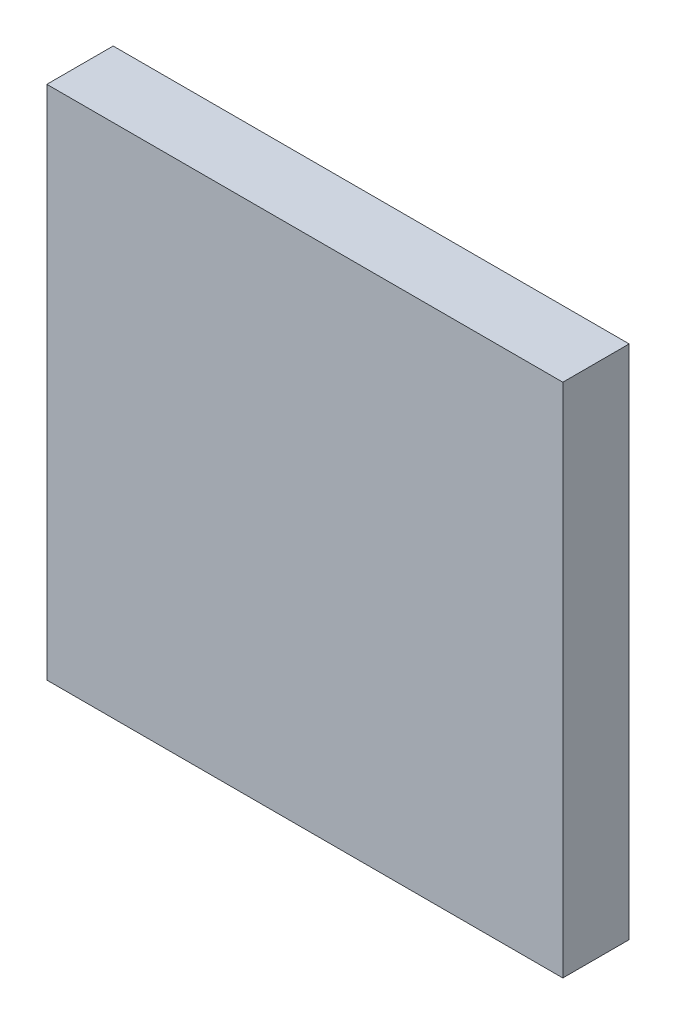
ISO-10303-21;
HEADER;
FILE_DESCRIPTION(('STEP AP214'),'2;1');
FILE_NAME('part.step','',(''),(''),'','','');
FILE_SCHEMA(('AUTOMOTIVE_DESIGN { 1 0 10303 214 1 1 1 1 }'));
ENDSEC;
DATA;
#1=APPLICATION_CONTEXT('core data for automotive mechanical design processes');
#2=APPLICATION_PROTOCOL_DEFINITION('international standard','automotive_design',2000,#1);
#3=PRODUCT_CONTEXT('',#1,'mechanical');
#4=PRODUCT('Part','Part','',(#3));
#5=PRODUCT_RELATED_PRODUCT_CATEGORY('part','',(#4));
#6=PRODUCT_DEFINITION_FORMATION('','',#4);
#7=PRODUCT_DEFINITION_CONTEXT('part definition',#1,'design');
#8=PRODUCT_DEFINITION('design','',#6,#7);
#9=PRODUCT_DEFINITION_SHAPE('','',#8);
#10=(LENGTH_UNIT() NAMED_UNIT(*) SI_UNIT(.MILLI.,.METRE.));
#11=(NAMED_UNIT(*) PLANE_ANGLE_UNIT() SI_UNIT($,.RADIAN.));
#12=(NAMED_UNIT(*) SI_UNIT($,.STERADIAN.) SOLID_ANGLE_UNIT());
#13=UNCERTAINTY_MEASURE_WITH_UNIT(LENGTH_MEASURE(1.E-05),#10,'distance_accuracy_value','');
#14=(GEOMETRIC_REPRESENTATION_CONTEXT(3) GLOBAL_UNCERTAINTY_ASSIGNED_CONTEXT((#13)) GLOBAL_UNIT_ASSIGNED_CONTEXT((#10,
#11,#12)) REPRESENTATION_CONTEXT('',''));
#15=CARTESIAN_POINT('',(0.,0.,0.));
#16=DIRECTION('',(0.,0.,1.));
#17=DIRECTION('',(1.,0.,0.));
#18=AXIS2_PLACEMENT_3D('',#15,#16,#17);
#19=CARTESIAN_POINT('',(-0.007770061208239,0.007073694149879,0.1));
#20=DIRECTION('',(0.,0.,1.));
#21=DIRECTION('',(1.,0.,0.));
#22=AXIS2_PLACEMENT_3D('',#19,#20,#21);
#23=PLANE('',#22);
#24=DIRECTION('',(0.,1.,0.));
#25=VECTOR('',#24,1.);
#26=CARTESIAN_POINT('',(-1.555356537529,1.276189145555,0.1));
#27=LINE('',#26,#25);
#28=CARTESIAN_POINT('',(-1.555356537529,1.276189145555,0.1));
#29=VERTEX_POINT('',#28);
#30=CARTESIAN_POINT('',(-1.555356537529,1.55,0.1));
#31=VERTEX_POINT('',#30);
#32=EDGE_CURVE('E11',#29,#31,#27,.T.);
#33=ORIENTED_EDGE('',*,*,#32,.T.);
#34=DIRECTION('',(1.,0.,0.));
#35=VECTOR('',#34,1.);
#36=CARTESIAN_POINT('',(-1.555356537529,1.55,0.1));
#37=LINE('',#36,#35);
#38=CARTESIAN_POINT('',(1.544643462471,1.55,0.1));
#39=VERTEX_POINT('',#38);
#40=EDGE_CURVE('E26',#31,#39,#37,.T.);
#41=ORIENTED_EDGE('',*,*,#40,.T.);
#42=DIRECTION('',(0.,-1.,0.));
#43=VECTOR('',#42,1.);
#44=CARTESIAN_POINT('',(1.544643462471,1.55,0.1));
#45=LINE('',#44,#43);
#46=CARTESIAN_POINT('',(1.544643462471,-1.55,0.1));
#47=VERTEX_POINT('',#46);
#48=EDGE_CURVE('E229',#39,#47,#45,.T.);
#49=ORIENTED_EDGE('',*,*,#48,.T.);
#50=DIRECTION('',(-1.,0.,0.));
#51=VECTOR('',#50,1.);
#52=CARTESIAN_POINT('',(1.544643462471,-1.55,0.1));
#53=LINE('',#52,#51);
#54=CARTESIAN_POINT('',(-1.544643462471,-1.55,0.1));
#55=VERTEX_POINT('',#54);
#56=EDGE_CURVE('E216',#47,#55,#53,.T.);
#57=ORIENTED_EDGE('',*,*,#56,.T.);
#58=DIRECTION('',(0.,1.,0.));
#59=VECTOR('',#58,1.);
#60=CARTESIAN_POINT('',(-1.544643462471,-1.55,0.1));
#61=LINE('',#60,#59);
#62=CARTESIAN_POINT('',(-1.544643462471,0.93,0.1));
#63=VERTEX_POINT('',#62);
#64=EDGE_CURVE('E215',#55,#63,#61,.T.);
#65=ORIENTED_EDGE('',*,*,#64,.T.);
#66=CARTESIAN_POINT('',(-1.65,1.1,0.1));
#67=DIRECTION('',(0.,0.,-1.));
#68=DIRECTION('',(1.,0.,0.));
#69=AXIS2_PLACEMENT_3D('',#66,#67,#68);
#70=CIRCLE('',#69,0.2);
#71=EDGE_CURVE('E203',#29,#63,#70,.T.);
#72=ORIENTED_EDGE('',*,*,#71,.F.);
#73=EDGE_LOOP('',(#33,#41,#49,#57,#65,#72));
#74=FACE_BOUND('',#73,.T.);
#75=ADVANCED_FACE('F17',(#74),#23,.F.);
#76=CARTESIAN_POINT('',(-1.555356537529,1.276189145555,0.));
#77=DIRECTION('',(-1.,0.,0.));
#78=DIRECTION('',(0.,0.,1.));
#79=AXIS2_PLACEMENT_3D('',#76,#77,#78);
#80=PLANE('',#79);
#81=DIRECTION('',(0.,0.,1.));
#82=VECTOR('',#81,1.);
#83=CARTESIAN_POINT('',(-1.555356537529,1.276189145555,0.));
#84=LINE('',#83,#82);
#85=CARTESIAN_POINT('',(-1.555356537529,1.276189145555,0.));
#86=VERTEX_POINT('',#85);
#87=EDGE_CURVE('E199',#86,#29,#84,.T.);
#88=ORIENTED_EDGE('',*,*,#87,.F.);
#89=DIRECTION('',(0.,1.,0.));
#90=VECTOR('',#89,1.);
#91=CARTESIAN_POINT('',(-1.555356537529,1.276189145555,0.));
#92=LINE('',#91,#90);
#93=CARTESIAN_POINT('',(-1.555356537529,1.55,0.));
#94=VERTEX_POINT('',#93);
#95=EDGE_CURVE('E184',#86,#94,#92,.T.);
#96=ORIENTED_EDGE('',*,*,#95,.T.);
#97=DIRECTION('',(0.,0.,1.));
#98=VECTOR('',#97,1.);
#99=CARTESIAN_POINT('',(-1.555356537529,1.55,0.));
#100=LINE('',#99,#98);
#101=EDGE_CURVE('E192',#94,#31,#100,.T.);
#102=ORIENTED_EDGE('',*,*,#101,.T.);
#103=ORIENTED_EDGE('',*,*,#32,.F.);
#104=EDGE_LOOP('',(#88,#96,#102,#103));
#105=FACE_BOUND('',#104,.T.);
#106=ADVANCED_FACE('F19',(#105),#80,.F.);
#107=CARTESIAN_POINT('',(-1.555356537529,1.55,0.));
#108=DIRECTION('',(0.,1.,0.));
#109=DIRECTION('',(1.,0.,0.));
#110=AXIS2_PLACEMENT_3D('',#107,#108,#109);
#111=PLANE('',#110);
#112=ORIENTED_EDGE('',*,*,#101,.F.);
#113=DIRECTION('',(1.,0.,0.));
#114=VECTOR('',#113,1.);
#115=CARTESIAN_POINT('',(-1.555356537529,1.55,0.));
#116=LINE('',#115,#114);
#117=CARTESIAN_POINT('',(1.544643462471,1.55,0.));
#118=VERTEX_POINT('',#117);
#119=EDGE_CURVE('E153',#94,#118,#116,.T.);
#120=ORIENTED_EDGE('',*,*,#119,.T.);
#121=DIRECTION('',(0.,0.,1.));
#122=VECTOR('',#121,1.);
#123=CARTESIAN_POINT('',(1.544643462471,1.55,0.));
#124=LINE('',#123,#122);
#125=EDGE_CURVE('E219',#118,#39,#124,.T.);
#126=ORIENTED_EDGE('',*,*,#125,.T.);
#127=ORIENTED_EDGE('',*,*,#40,.F.);
#128=EDGE_LOOP('',(#112,#120,#126,#127));
#129=FACE_BOUND('',#128,.T.);
#130=ADVANCED_FACE('F238',(#129),#111,.F.);
#131=CARTESIAN_POINT('',(1.544643462471,1.55,0.));
#132=DIRECTION('',(1.,0.,0.));
#133=DIRECTION('',(0.,1.,0.));
#134=AXIS2_PLACEMENT_3D('',#131,#132,#133);
#135=PLANE('',#134);
#136=ORIENTED_EDGE('',*,*,#125,.F.);
#137=DIRECTION('',(0.,-1.,0.));
#138=VECTOR('',#137,1.);
#139=CARTESIAN_POINT('',(1.544643462471,1.55,0.));
#140=LINE('',#139,#138);
#141=CARTESIAN_POINT('',(1.544643462471,-1.55,0.));
#142=VERTEX_POINT('',#141);
#143=EDGE_CURVE('E151',#118,#142,#140,.T.);
#144=ORIENTED_EDGE('',*,*,#143,.T.);
#145=DIRECTION('',(0.,0.,1.));
#146=VECTOR('',#145,1.);
#147=CARTESIAN_POINT('',(1.544643462471,-1.55,0.));
#148=LINE('',#147,#146);
#149=EDGE_CURVE('E220',#142,#47,#148,.T.);
#150=ORIENTED_EDGE('',*,*,#149,.T.);
#151=ORIENTED_EDGE('',*,*,#48,.F.);
#152=EDGE_LOOP('',(#136,#144,#150,#151));
#153=FACE_BOUND('',#152,.T.);
#154=ADVANCED_FACE('F241',(#153),#135,.F.);
#155=CARTESIAN_POINT('',(1.544643462471,-1.55,0.));
#156=DIRECTION('',(0.,-1.,0.));
#157=DIRECTION('',(0.,0.,-1.));
#158=AXIS2_PLACEMENT_3D('',#155,#156,#157);
#159=PLANE('',#158);
#160=ORIENTED_EDGE('',*,*,#149,.F.);
#161=DIRECTION('',(-1.,0.,0.));
#162=VECTOR('',#161,1.);
#163=CARTESIAN_POINT('',(1.544643462471,-1.55,0.));
#164=LINE('',#163,#162);
#165=CARTESIAN_POINT('',(-1.544643462471,-1.55,0.));
#166=VERTEX_POINT('',#165);
#167=EDGE_CURVE('E154',#142,#166,#164,.T.);
#168=ORIENTED_EDGE('',*,*,#167,.T.);
#169=DIRECTION('',(0.,0.,1.));
#170=VECTOR('',#169,1.);
#171=CARTESIAN_POINT('',(-1.544643462471,-1.55,0.));
#172=LINE('',#171,#170);
#173=EDGE_CURVE('E211',#166,#55,#172,.T.);
#174=ORIENTED_EDGE('',*,*,#173,.T.);
#175=ORIENTED_EDGE('',*,*,#56,.F.);
#176=EDGE_LOOP('',(#160,#168,#174,#175));
#177=FACE_BOUND('',#176,.T.);
#178=ADVANCED_FACE('F246',(#177),#159,.F.);
#179=CARTESIAN_POINT('',(-1.544643462471,-1.55,0.));
#180=DIRECTION('',(-1.,0.,0.));
#181=DIRECTION('',(0.,0.,1.));
#182=AXIS2_PLACEMENT_3D('',#179,#180,#181);
#183=PLANE('',#182);
#184=ORIENTED_EDGE('',*,*,#173,.F.);
#185=DIRECTION('',(0.,1.,0.));
#186=VECTOR('',#185,1.);
#187=CARTESIAN_POINT('',(-1.544643462471,-1.55,0.));
#188=LINE('',#187,#186);
#189=CARTESIAN_POINT('',(-1.544643462471,0.93,0.));
#190=VERTEX_POINT('',#189);
#191=EDGE_CURVE('E164',#166,#190,#188,.T.);
#192=ORIENTED_EDGE('',*,*,#191,.T.);
#193=DIRECTION('',(0.,0.,1.));
#194=VECTOR('',#193,1.);
#195=CARTESIAN_POINT('',(-1.544643462471,0.93,0.));
#196=LINE('',#195,#194);
#197=EDGE_CURVE('E207',#190,#63,#196,.T.);
#198=ORIENTED_EDGE('',*,*,#197,.T.);
#199=ORIENTED_EDGE('',*,*,#64,.F.);
#200=EDGE_LOOP('',(#184,#192,#198,#199));
#201=FACE_BOUND('',#200,.T.);
#202=ADVANCED_FACE('F249',(#201),#183,.F.);
#203=CARTESIAN_POINT('',(-1.65,1.1,0.));
#204=DIRECTION('',(0.,0.,-1.));
#205=DIRECTION('',(1.,0.,0.));
#206=AXIS2_PLACEMENT_3D('',#203,#204,#205);
#207=CYLINDRICAL_SURFACE('',#206,0.2);
#208=ORIENTED_EDGE('',*,*,#87,.T.);
#209=ORIENTED_EDGE('',*,*,#71,.T.);
#210=ORIENTED_EDGE('',*,*,#197,.F.);
#211=CARTESIAN_POINT('',(-1.65,1.1,0.));
#212=DIRECTION('',(0.,0.,-1.));
#213=DIRECTION('',(1.,0.,0.));
#214=AXIS2_PLACEMENT_3D('',#211,#212,#213);
#215=CIRCLE('',#214,0.2);
#216=EDGE_CURVE('E160',#86,#190,#215,.T.);
#217=ORIENTED_EDGE('',*,*,#216,.F.);
#218=EDGE_LOOP('',(#208,#209,#210,#217));
#219=FACE_BOUND('',#218,.T.);
#220=ADVANCED_FACE('F252',(#219),#207,.T.);
#221=CARTESIAN_POINT('',(3.5,-3.5,0.));
#222=DIRECTION('',(-1.,0.,0.));
#223=DIRECTION('',(0.,0.,1.));
#224=AXIS2_PLACEMENT_3D('',#221,#222,#223);
#225=PLANE('',#224);
#226=DIRECTION('',(0.,0.,1.));
#227=VECTOR('',#226,1.);
#228=CARTESIAN_POINT('',(3.5,-3.5,0.));
#229=LINE('',#228,#227);
#230=CARTESIAN_POINT('',(3.5,-3.5,0.));
#231=VERTEX_POINT('',#230);
#232=CARTESIAN_POINT('',(3.5,-3.5,0.9));
#233=VERTEX_POINT('',#232);
#234=EDGE_CURVE('E166',#231,#233,#229,.T.);
#235=ORIENTED_EDGE('',*,*,#234,.F.);
#236=DIRECTION('',(0.,1.,0.));
#237=VECTOR('',#236,1.);
#238=CARTESIAN_POINT('',(3.5,-3.5,0.));
#239=LINE('',#238,#237);
#240=CARTESIAN_POINT('',(3.5,3.5,0.));
#241=VERTEX_POINT('',#240);
#242=EDGE_CURVE('E165',#231,#241,#239,.T.);
#243=ORIENTED_EDGE('',*,*,#242,.T.);
#244=DIRECTION('',(0.,0.,1.));
#245=VECTOR('',#244,1.);
#246=CARTESIAN_POINT('',(3.5,3.5,0.));
#247=LINE('',#246,#245);
#248=CARTESIAN_POINT('',(3.5,3.5,0.9));
#249=VERTEX_POINT('',#248);
#250=EDGE_CURVE('E124',#241,#249,#247,.T.);
#251=ORIENTED_EDGE('',*,*,#250,.T.);
#252=DIRECTION('',(0.,1.,0.));
#253=VECTOR('',#252,1.);
#254=CARTESIAN_POINT('',(3.5,-3.5,0.9));
#255=LINE('',#254,#253);
#256=EDGE_CURVE('E196',#233,#249,#255,.T.);
#257=ORIENTED_EDGE('',*,*,#256,.F.);
#258=EDGE_LOOP('',(#235,#243,#251,#257));
#259=FACE_BOUND('',#258,.T.);
#260=ADVANCED_FACE('F265',(#259),#225,.F.);
#261=CARTESIAN_POINT('',(0.,0.,0.9));
#262=DIRECTION('',(0.,0.,1.));
#263=DIRECTION('',(1.,0.,0.));
#264=AXIS2_PLACEMENT_3D('',#261,#262,#263);
#265=PLANE('',#264);
#266=DIRECTION('',(0.,-1.,0.));
#267=VECTOR('',#266,1.);
#268=CARTESIAN_POINT('',(-3.5,3.5,0.9));
#269=LINE('',#268,#267);
#270=CARTESIAN_POINT('',(-3.5,3.5,0.9));
#271=VERTEX_POINT('',#270);
#272=CARTESIAN_POINT('',(-3.5,-3.5,0.9));
#273=VERTEX_POINT('',#272);
#274=EDGE_CURVE('E143',#271,#273,#269,.T.);
#275=ORIENTED_EDGE('',*,*,#274,.T.);
#276=DIRECTION('',(1.,0.,0.));
#277=VECTOR('',#276,1.);
#278=CARTESIAN_POINT('',(-3.5,-3.5,0.9));
#279=LINE('',#278,#277);
#280=EDGE_CURVE('E170',#273,#233,#279,.T.);
#281=ORIENTED_EDGE('',*,*,#280,.T.);
#282=ORIENTED_EDGE('',*,*,#256,.T.);
#283=DIRECTION('',(-1.,0.,0.));
#284=VECTOR('',#283,1.);
#285=CARTESIAN_POINT('',(3.5,3.5,0.9));
#286=LINE('',#285,#284);
#287=EDGE_CURVE('E127',#249,#271,#286,.T.);
#288=ORIENTED_EDGE('',*,*,#287,.T.);
#289=EDGE_LOOP('',(#275,#281,#282,#288));
#290=FACE_BOUND('',#289,.T.);
#291=ADVANCED_FACE('F256',(#290),#265,.T.);
#292=CARTESIAN_POINT('',(0.,0.,0.));
#293=DIRECTION('',(0.,0.,1.));
#294=DIRECTION('',(1.,0.,0.));
#295=AXIS2_PLACEMENT_3D('',#292,#293,#294);
#296=PLANE('',#295);
#297=ORIENTED_EDGE('',*,*,#216,.T.);
#298=ORIENTED_EDGE('',*,*,#191,.F.);
#299=ORIENTED_EDGE('',*,*,#167,.F.);
#300=ORIENTED_EDGE('',*,*,#143,.F.);
#301=ORIENTED_EDGE('',*,*,#119,.F.);
#302=ORIENTED_EDGE('',*,*,#95,.F.);
#303=EDGE_LOOP('',(#297,#298,#299,#300,#301,#302));
#304=FACE_BOUND('',#303,.T.);
#305=DIRECTION('',(0.,-1.,0.));
#306=VECTOR('',#305,1.);
#307=CARTESIAN_POINT('',(-3.5,3.5,0.));
#308=LINE('',#307,#306);
#309=CARTESIAN_POINT('',(-3.5,3.5,0.));
#310=VERTEX_POINT('',#309);
#311=CARTESIAN_POINT('',(-3.5,-3.5,0.));
#312=VERTEX_POINT('',#311);
#313=EDGE_CURVE('E130',#310,#312,#308,.T.);
#314=ORIENTED_EDGE('',*,*,#313,.F.);
#315=DIRECTION('',(-1.,0.,0.));
#316=VECTOR('',#315,1.);
#317=CARTESIAN_POINT('',(3.5,3.5,0.));
#318=LINE('',#317,#316);
#319=EDGE_CURVE('E117',#241,#310,#318,.T.);
#320=ORIENTED_EDGE('',*,*,#319,.F.);
#321=ORIENTED_EDGE('',*,*,#242,.F.);
#322=DIRECTION('',(1.,0.,0.));
#323=VECTOR('',#322,1.);
#324=CARTESIAN_POINT('',(-3.5,-3.5,0.));
#325=LINE('',#324,#323);
#326=EDGE_CURVE('E133',#312,#231,#325,.T.);
#327=ORIENTED_EDGE('',*,*,#326,.F.);
#328=EDGE_LOOP('',(#314,#320,#321,#327));
#329=FACE_BOUND('',#328,.T.);
#330=ADVANCED_FACE('F131',(#304,#329),#296,.F.);
#331=CARTESIAN_POINT('',(-3.5,-3.5,0.));
#332=DIRECTION('',(0.,1.,0.));
#333=DIRECTION('',(1.,0.,0.));
#334=AXIS2_PLACEMENT_3D('',#331,#332,#333);
#335=PLANE('',#334);
#336=DIRECTION('',(0.,0.,1.));
#337=VECTOR('',#336,1.);
#338=CARTESIAN_POINT('',(-3.5,-3.5,0.));
#339=LINE('',#338,#337);
#340=EDGE_CURVE('E138',#312,#273,#339,.T.);
#341=ORIENTED_EDGE('',*,*,#340,.F.);
#342=ORIENTED_EDGE('',*,*,#326,.T.);
#343=ORIENTED_EDGE('',*,*,#234,.T.);
#344=ORIENTED_EDGE('',*,*,#280,.F.);
#345=EDGE_LOOP('',(#341,#342,#343,#344));
#346=FACE_BOUND('',#345,.T.);
#347=ADVANCED_FACE('F255',(#346),#335,.F.);
#348=CARTESIAN_POINT('',(3.5,3.5,0.));
#349=DIRECTION('',(0.,-1.,0.));
#350=DIRECTION('',(0.,0.,-1.));
#351=AXIS2_PLACEMENT_3D('',#348,#349,#350);
#352=PLANE('',#351);
#353=ORIENTED_EDGE('',*,*,#250,.F.);
#354=ORIENTED_EDGE('',*,*,#319,.T.);
#355=DIRECTION('',(0.,0.,1.));
#356=VECTOR('',#355,1.);
#357=CARTESIAN_POINT('',(-3.5,3.5,0.));
#358=LINE('',#357,#356);
#359=EDGE_CURVE('E122',#310,#271,#358,.T.);
#360=ORIENTED_EDGE('',*,*,#359,.T.);
#361=ORIENTED_EDGE('',*,*,#287,.F.);
#362=EDGE_LOOP('',(#353,#354,#360,#361));
#363=FACE_BOUND('',#362,.T.);
#364=ADVANCED_FACE('F119',(#363),#352,.F.);
#365=CARTESIAN_POINT('',(-3.5,3.5,0.));
#366=DIRECTION('',(1.,0.,0.));
#367=DIRECTION('',(0.,1.,0.));
#368=AXIS2_PLACEMENT_3D('',#365,#366,#367);
#369=PLANE('',#368);
#370=ORIENTED_EDGE('',*,*,#359,.F.);
#371=ORIENTED_EDGE('',*,*,#313,.T.);
#372=ORIENTED_EDGE('',*,*,#340,.T.);
#373=ORIENTED_EDGE('',*,*,#274,.F.);
#374=EDGE_LOOP('',(#370,#371,#372,#373));
#375=FACE_BOUND('',#374,.T.);
#376=ADVANCED_FACE('F141',(#375),#369,.F.);
#377=CLOSED_SHELL('',(#75,#106,#130,#154,#178,#202,#220,#260,#291,#330,#347,#364,#376));
#378=MANIFOLD_SOLID_BREP('B1',#377);
#379=ADVANCED_BREP_SHAPE_REPRESENTATION('',(#18,#378),#14);
#380=SHAPE_DEFINITION_REPRESENTATION(#9,#379);
ENDSEC;
END-ISO-10303-21;
